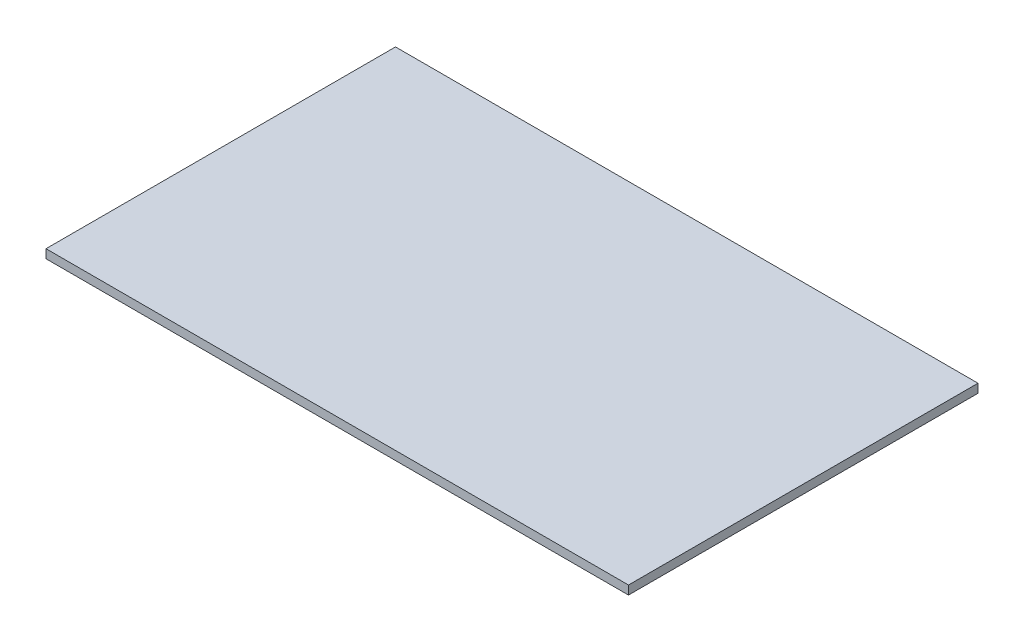
ISO-10303-21;
HEADER;
FILE_DESCRIPTION(('STEP AP214'),'2;1');
FILE_NAME('part.step','',(''),(''),'','','');
FILE_SCHEMA(('AUTOMOTIVE_DESIGN { 1 0 10303 214 1 1 1 1 }'));
ENDSEC;
DATA;
#1=APPLICATION_CONTEXT('core data for automotive mechanical design processes');
#2=APPLICATION_PROTOCOL_DEFINITION('international standard','automotive_design',2000,#1);
#3=PRODUCT_CONTEXT('',#1,'mechanical');
#4=PRODUCT('Part','Part','',(#3));
#5=PRODUCT_RELATED_PRODUCT_CATEGORY('part','',(#4));
#6=PRODUCT_DEFINITION_FORMATION('','',#4);
#7=PRODUCT_DEFINITION_CONTEXT('part definition',#1,'design');
#8=PRODUCT_DEFINITION('design','',#6,#7);
#9=PRODUCT_DEFINITION_SHAPE('','',#8);
#10=(LENGTH_UNIT() NAMED_UNIT(*) SI_UNIT(.MILLI.,.METRE.));
#11=(NAMED_UNIT(*) PLANE_ANGLE_UNIT() SI_UNIT($,.RADIAN.));
#12=(NAMED_UNIT(*) SI_UNIT($,.STERADIAN.) SOLID_ANGLE_UNIT());
#13=UNCERTAINTY_MEASURE_WITH_UNIT(LENGTH_MEASURE(1.E-05),#10,'distance_accuracy_value','');
#14=(GEOMETRIC_REPRESENTATION_CONTEXT(3) GLOBAL_UNCERTAINTY_ASSIGNED_CONTEXT((#13)) GLOBAL_UNIT_ASSIGNED_CONTEXT((#10,
#11,#12)) REPRESENTATION_CONTEXT('',''));
#15=CARTESIAN_POINT('',(0.,0.,0.));
#16=DIRECTION('',(0.,0.,1.));
#17=DIRECTION('',(1.,0.,0.));
#18=AXIS2_PLACEMENT_3D('',#15,#16,#17);
#19=CARTESIAN_POINT('',(0.,7.62,0.));
#20=DIRECTION('',(1.,0.,0.));
#21=DIRECTION('',(0.,0.,-1.));
#22=AXIS2_PLACEMENT_3D('',#19,#20,#21);
#23=PLANE('',#22);
#24=DIRECTION('',(0.,0.,1.));
#25=VECTOR('',#24,1.);
#26=CARTESIAN_POINT('',(0.,0.,0.));
#27=LINE('',#26,#25);
#28=CARTESIAN_POINT('',(0.,0.,-304.8));
#29=VERTEX_POINT('',#28);
#30=CARTESIAN_POINT('',(0.,0.,0.));
#31=VERTEX_POINT('',#30);
#32=EDGE_CURVE('E98',#29,#31,#27,.T.);
#33=ORIENTED_EDGE('',*,*,#32,.T.);
#34=DIRECTION('',(0.,-1.,0.));
#35=VECTOR('',#34,1.);
#36=CARTESIAN_POINT('',(0.,7.62,0.));
#37=LINE('',#36,#35);
#38=CARTESIAN_POINT('',(0.,7.62,0.));
#39=VERTEX_POINT('',#38);
#40=EDGE_CURVE('E11',#39,#31,#37,.T.);
#41=ORIENTED_EDGE('',*,*,#40,.F.);
#42=DIRECTION('',(0.,0.,1.));
#43=VECTOR('',#42,1.);
#44=CARTESIAN_POINT('',(0.,7.62,0.));
#45=LINE('',#44,#43);
#46=CARTESIAN_POINT('',(0.,7.62,-304.8));
#47=VERTEX_POINT('',#46);
#48=EDGE_CURVE('E86',#47,#39,#45,.T.);
#49=ORIENTED_EDGE('',*,*,#48,.F.);
#50=DIRECTION('',(0.,-1.,0.));
#51=VECTOR('',#50,1.);
#52=CARTESIAN_POINT('',(0.,7.62,-304.8));
#53=LINE('',#52,#51);
#54=EDGE_CURVE('E94',#47,#29,#53,.T.);
#55=ORIENTED_EDGE('',*,*,#54,.T.);
#56=EDGE_LOOP('',(#33,#41,#49,#55));
#57=FACE_BOUND('',#56,.T.);
#58=ADVANCED_FACE('F35',(#57),#23,.F.);
#59=CARTESIAN_POINT('',(0.,7.62,0.));
#60=DIRECTION('',(0.,0.,-1.));
#61=DIRECTION('',(-1.,0.,0.));
#62=AXIS2_PLACEMENT_3D('',#59,#60,#61);
#63=PLANE('',#62);
#64=DIRECTION('',(1.,0.,0.));
#65=VECTOR('',#64,1.);
#66=CARTESIAN_POINT('',(0.,0.,0.));
#67=LINE('',#66,#65);
#68=CARTESIAN_POINT('',(508.,0.,0.));
#69=VERTEX_POINT('',#68);
#70=EDGE_CURVE('E90',#31,#69,#67,.T.);
#71=ORIENTED_EDGE('',*,*,#70,.T.);
#72=DIRECTION('',(0.,-1.,0.));
#73=VECTOR('',#72,1.);
#74=CARTESIAN_POINT('',(508.,7.62,0.));
#75=LINE('',#74,#73);
#76=CARTESIAN_POINT('',(508.,7.62,0.));
#77=VERTEX_POINT('',#76);
#78=EDGE_CURVE('E43',#77,#69,#75,.T.);
#79=ORIENTED_EDGE('',*,*,#78,.F.);
#80=DIRECTION('',(1.,0.,0.));
#81=VECTOR('',#80,1.);
#82=CARTESIAN_POINT('',(0.,7.62,0.));
#83=LINE('',#82,#81);
#84=EDGE_CURVE('E81',#39,#77,#83,.T.);
#85=ORIENTED_EDGE('',*,*,#84,.F.);
#86=ORIENTED_EDGE('',*,*,#40,.T.);
#87=EDGE_LOOP('',(#71,#79,#85,#86));
#88=FACE_BOUND('',#87,.T.);
#89=ADVANCED_FACE('F89',(#88),#63,.F.);
#90=CARTESIAN_POINT('',(508.,7.62,0.));
#91=DIRECTION('',(-1.,0.,0.));
#92=DIRECTION('',(0.,0.,1.));
#93=AXIS2_PLACEMENT_3D('',#90,#91,#92);
#94=PLANE('',#93);
#95=DIRECTION('',(0.,0.,-1.));
#96=VECTOR('',#95,1.);
#97=CARTESIAN_POINT('',(508.,0.,0.));
#98=LINE('',#97,#96);
#99=CARTESIAN_POINT('',(508.,0.,-304.8));
#100=VERTEX_POINT('',#99);
#101=EDGE_CURVE('E68',#69,#100,#98,.T.);
#102=ORIENTED_EDGE('',*,*,#101,.T.);
#103=DIRECTION('',(0.,-1.,0.));
#104=VECTOR('',#103,1.);
#105=CARTESIAN_POINT('',(508.,7.62,-304.8));
#106=LINE('',#105,#104);
#107=CARTESIAN_POINT('',(508.,7.62,-304.8));
#108=VERTEX_POINT('',#107);
#109=EDGE_CURVE('E91',#108,#100,#106,.T.);
#110=ORIENTED_EDGE('',*,*,#109,.F.);
#111=DIRECTION('',(0.,0.,-1.));
#112=VECTOR('',#111,1.);
#113=CARTESIAN_POINT('',(508.,7.62,0.));
#114=LINE('',#113,#112);
#115=EDGE_CURVE('E84',#77,#108,#114,.T.);
#116=ORIENTED_EDGE('',*,*,#115,.F.);
#117=ORIENTED_EDGE('',*,*,#78,.T.);
#118=EDGE_LOOP('',(#102,#110,#116,#117));
#119=FACE_BOUND('',#118,.T.);
#120=ADVANCED_FACE('F92',(#119),#94,.F.);
#121=CARTESIAN_POINT('',(0.,7.62,-304.8));
#122=DIRECTION('',(0.,0.,1.));
#123=DIRECTION('',(1.,0.,0.));
#124=AXIS2_PLACEMENT_3D('',#121,#122,#123);
#125=PLANE('',#124);
#126=DIRECTION('',(-1.,0.,0.));
#127=VECTOR('',#126,1.);
#128=CARTESIAN_POINT('',(0.,0.,-304.8));
#129=LINE('',#128,#127);
#130=EDGE_CURVE('E74',#100,#29,#129,.T.);
#131=ORIENTED_EDGE('',*,*,#130,.T.);
#132=ORIENTED_EDGE('',*,*,#54,.F.);
#133=DIRECTION('',(-1.,0.,0.));
#134=VECTOR('',#133,1.);
#135=CARTESIAN_POINT('',(0.,7.62,-304.8));
#136=LINE('',#135,#134);
#137=EDGE_CURVE('E51',#108,#47,#136,.T.);
#138=ORIENTED_EDGE('',*,*,#137,.F.);
#139=ORIENTED_EDGE('',*,*,#109,.T.);
#140=EDGE_LOOP('',(#131,#132,#138,#139));
#141=FACE_BOUND('',#140,.T.);
#142=ADVANCED_FACE('F105',(#141),#125,.F.);
#143=CARTESIAN_POINT('',(0.,7.62,0.));
#144=DIRECTION('',(0.,-1.,0.));
#145=DIRECTION('',(0.,0.,-1.));
#146=AXIS2_PLACEMENT_3D('',#143,#144,#145);
#147=PLANE('',#146);
#148=ORIENTED_EDGE('',*,*,#48,.T.);
#149=ORIENTED_EDGE('',*,*,#84,.T.);
#150=ORIENTED_EDGE('',*,*,#115,.T.);
#151=ORIENTED_EDGE('',*,*,#137,.T.);
#152=EDGE_LOOP('',(#148,#149,#150,#151));
#153=FACE_BOUND('',#152,.T.);
#154=ADVANCED_FACE('F82',(#153),#147,.F.);
#155=CARTESIAN_POINT('',(0.,0.,0.));
#156=DIRECTION('',(0.,-1.,0.));
#157=DIRECTION('',(0.,0.,-1.));
#158=AXIS2_PLACEMENT_3D('',#155,#156,#157);
#159=PLANE('',#158);
#160=ORIENTED_EDGE('',*,*,#32,.F.);
#161=ORIENTED_EDGE('',*,*,#130,.F.);
#162=ORIENTED_EDGE('',*,*,#101,.F.);
#163=ORIENTED_EDGE('',*,*,#70,.F.);
#164=EDGE_LOOP('',(#160,#161,#162,#163));
#165=FACE_BOUND('',#164,.T.);
#166=ADVANCED_FACE('F108',(#165),#159,.T.);
#167=CLOSED_SHELL('',(#58,#89,#120,#142,#154,#166));
#168=MANIFOLD_SOLID_BREP('B2',#167);
#169=ADVANCED_BREP_SHAPE_REPRESENTATION('',(#18,#168),#14);
#170=SHAPE_DEFINITION_REPRESENTATION(#9,#169);
ENDSEC;
END-ISO-10303-21;
